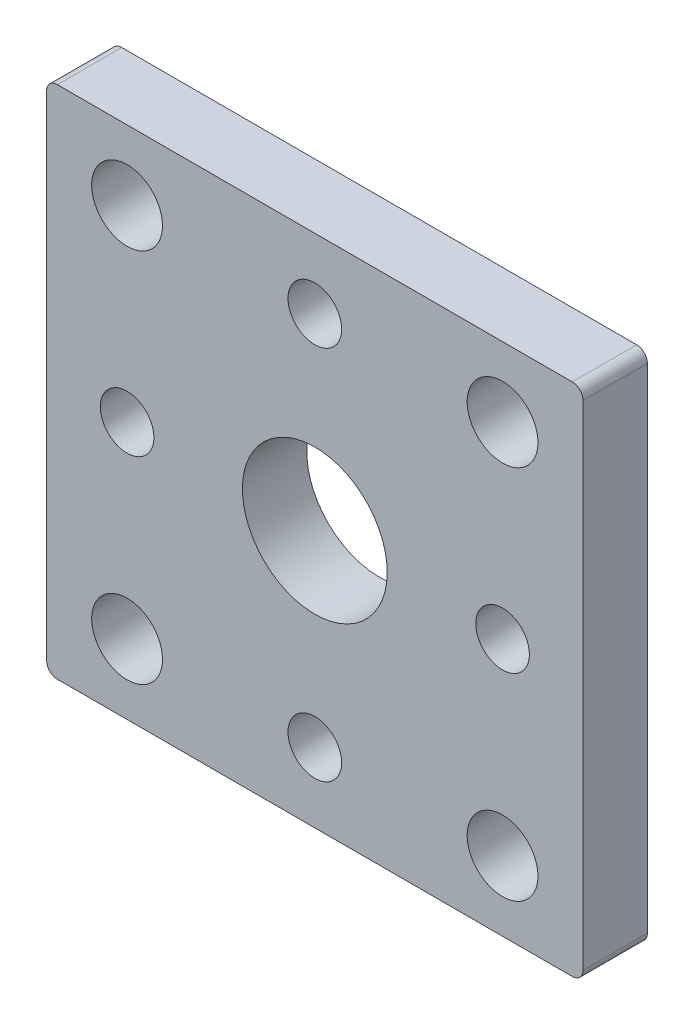
ISO-10303-21;
HEADER;
FILE_DESCRIPTION(('STEP AP214'),'2;1');
FILE_NAME('part.step','',(''),(''),'','','');
FILE_SCHEMA(('AUTOMOTIVE_DESIGN { 1 0 10303 214 1 1 1 1 }'));
ENDSEC;
DATA;
#1=APPLICATION_CONTEXT('core data for automotive mechanical design processes');
#2=APPLICATION_PROTOCOL_DEFINITION('international standard','automotive_design',2000,#1);
#3=PRODUCT_CONTEXT('',#1,'mechanical');
#4=PRODUCT('Part','Part','',(#3));
#5=PRODUCT_RELATED_PRODUCT_CATEGORY('part','',(#4));
#6=PRODUCT_DEFINITION_FORMATION('','',#4);
#7=PRODUCT_DEFINITION_CONTEXT('part definition',#1,'design');
#8=PRODUCT_DEFINITION('design','',#6,#7);
#9=PRODUCT_DEFINITION_SHAPE('','',#8);
#10=(LENGTH_UNIT() NAMED_UNIT(*) SI_UNIT(.MILLI.,.METRE.));
#11=(NAMED_UNIT(*) PLANE_ANGLE_UNIT() SI_UNIT($,.RADIAN.));
#12=(NAMED_UNIT(*) SI_UNIT($,.STERADIAN.) SOLID_ANGLE_UNIT());
#13=UNCERTAINTY_MEASURE_WITH_UNIT(LENGTH_MEASURE(1.E-05),#10,'distance_accuracy_value','');
#14=(GEOMETRIC_REPRESENTATION_CONTEXT(3) GLOBAL_UNCERTAINTY_ASSIGNED_CONTEXT((#13)) GLOBAL_UNIT_ASSIGNED_CONTEXT((#10,
#11,#12)) REPRESENTATION_CONTEXT('',''));
#15=CARTESIAN_POINT('',(0.,0.,0.));
#16=DIRECTION('',(0.,0.,1.));
#17=DIRECTION('',(1.,0.,0.));
#18=AXIS2_PLACEMENT_3D('',#15,#16,#17);
#19=CARTESIAN_POINT('',(0.,0.,6.));
#20=DIRECTION('',(0.,0.,-1.));
#21=DIRECTION('',(-1.,0.,0.));
#22=AXIS2_PLACEMENT_3D('',#19,#20,#21);
#23=PLANE('',#22);
#24=CARTESIAN_POINT('',(25.,-6.5,6.));
#25=DIRECTION('',(0.,0.,1.));
#26=DIRECTION('',(1.,0.,0.));
#27=AXIS2_PLACEMENT_3D('',#24,#25,#26);
#28=CIRCLE('',#27,2.5);
#29=CARTESIAN_POINT('',(27.5,-6.5,6.));
#30=VERTEX_POINT('',#29);
#31=EDGE_CURVE('E293',#30,#30,#28,.T.);
#32=ORIENTED_EDGE('',*,*,#31,.F.);
#33=EDGE_LOOP('',(#32));
#34=FACE_BOUND('',#33,.T.);
#35=CARTESIAN_POINT('',(42.5,-24.,6.));
#36=DIRECTION('',(0.,0.,1.));
#37=DIRECTION('',(1.,0.,0.));
#38=AXIS2_PLACEMENT_3D('',#35,#36,#37);
#39=CIRCLE('',#38,2.5);
#40=CARTESIAN_POINT('',(45.,-24.,6.));
#41=VERTEX_POINT('',#40);
#42=EDGE_CURVE('E285',#41,#41,#39,.T.);
#43=ORIENTED_EDGE('',*,*,#42,.F.);
#44=EDGE_LOOP('',(#43));
#45=FACE_BOUND('',#44,.T.);
#46=CARTESIAN_POINT('',(25.,-41.5,6.));
#47=DIRECTION('',(0.,0.,1.));
#48=DIRECTION('',(1.,0.,0.));
#49=AXIS2_PLACEMENT_3D('',#46,#47,#48);
#50=CIRCLE('',#49,2.5);
#51=CARTESIAN_POINT('',(27.5,-41.5,6.));
#52=VERTEX_POINT('',#51);
#53=EDGE_CURVE('E277',#52,#52,#50,.T.);
#54=ORIENTED_EDGE('',*,*,#53,.F.);
#55=EDGE_LOOP('',(#54));
#56=FACE_BOUND('',#55,.T.);
#57=CARTESIAN_POINT('',(7.5,-24.,6.));
#58=DIRECTION('',(0.,0.,1.));
#59=DIRECTION('',(1.,0.,0.));
#60=AXIS2_PLACEMENT_3D('',#57,#58,#59);
#61=CIRCLE('',#60,2.5);
#62=CARTESIAN_POINT('',(10.,-24.,6.));
#63=VERTEX_POINT('',#62);
#64=EDGE_CURVE('E269',#63,#63,#61,.T.);
#65=ORIENTED_EDGE('',*,*,#64,.F.);
#66=EDGE_LOOP('',(#65));
#67=FACE_BOUND('',#66,.T.);
#68=CARTESIAN_POINT('',(7.50000000000001,-41.5,6.));
#69=DIRECTION('',(0.,0.,1.));
#70=DIRECTION('',(1.,0.,0.));
#71=AXIS2_PLACEMENT_3D('',#68,#69,#70);
#72=CIRCLE('',#71,3.3);
#73=CARTESIAN_POINT('',(10.8,-41.5,6.));
#74=VERTEX_POINT('',#73);
#75=EDGE_CURVE('E243',#74,#74,#72,.T.);
#76=ORIENTED_EDGE('',*,*,#75,.F.);
#77=EDGE_LOOP('',(#76));
#78=FACE_BOUND('',#77,.T.);
#79=CARTESIAN_POINT('',(42.5,-41.5,6.));
#80=DIRECTION('',(0.,0.,1.));
#81=DIRECTION('',(1.,0.,0.));
#82=AXIS2_PLACEMENT_3D('',#79,#80,#81);
#83=CIRCLE('',#82,3.3);
#84=CARTESIAN_POINT('',(45.8,-41.5,6.));
#85=VERTEX_POINT('',#84);
#86=EDGE_CURVE('E251',#85,#85,#83,.F.);
#87=ORIENTED_EDGE('',*,*,#86,.T.);
#88=EDGE_LOOP('',(#87));
#89=FACE_BOUND('',#88,.T.);
#90=DIRECTION('',(1.,0.,0.));
#91=VECTOR('',#90,1.);
#92=CARTESIAN_POINT('',(50.,-48.,6.));
#93=LINE('',#92,#91);
#94=CARTESIAN_POINT('',(1.,-48.,6.));
#95=VERTEX_POINT('',#94);
#96=CARTESIAN_POINT('',(49.,-48.,6.));
#97=VERTEX_POINT('',#96);
#98=EDGE_CURVE('E206',#95,#97,#93,.T.);
#99=ORIENTED_EDGE('',*,*,#98,.T.);
#100=CARTESIAN_POINT('',(49.,-47.,6.));
#101=DIRECTION('',(0.,0.,-1.));
#102=DIRECTION('',(-1.,0.,0.));
#103=AXIS2_PLACEMENT_3D('',#100,#101,#102);
#104=CIRCLE('',#103,1.);
#105=CARTESIAN_POINT('',(50.,-47.,6.));
#106=VERTEX_POINT('',#105);
#107=EDGE_CURVE('E177',#97,#106,#104,.F.);
#108=ORIENTED_EDGE('',*,*,#107,.T.);
#109=DIRECTION('',(0.,1.,0.));
#110=VECTOR('',#109,1.);
#111=CARTESIAN_POINT('',(50.,0.,6.));
#112=LINE('',#111,#110);
#113=CARTESIAN_POINT('',(50.,-1.,6.));
#114=VERTEX_POINT('',#113);
#115=EDGE_CURVE('E132',#106,#114,#112,.T.);
#116=ORIENTED_EDGE('',*,*,#115,.T.);
#117=CARTESIAN_POINT('',(49.,-1.,6.));
#118=DIRECTION('',(0.,0.,-1.));
#119=DIRECTION('',(-1.,0.,0.));
#120=AXIS2_PLACEMENT_3D('',#117,#118,#119);
#121=CIRCLE('',#120,1.);
#122=CARTESIAN_POINT('',(49.,0.,6.));
#123=VERTEX_POINT('',#122);
#124=EDGE_CURVE('E67',#114,#123,#121,.F.);
#125=ORIENTED_EDGE('',*,*,#124,.T.);
#126=DIRECTION('',(-1.,0.,0.));
#127=VECTOR('',#126,1.);
#128=CARTESIAN_POINT('',(0.,0.,6.));
#129=LINE('',#128,#127);
#130=CARTESIAN_POINT('',(1.,0.,6.));
#131=VERTEX_POINT('',#130);
#132=EDGE_CURVE('E155',#123,#131,#129,.T.);
#133=ORIENTED_EDGE('',*,*,#132,.T.);
#134=CARTESIAN_POINT('',(1.,-1.,6.));
#135=DIRECTION('',(0.,0.,-1.));
#136=DIRECTION('',(-1.,0.,0.));
#137=AXIS2_PLACEMENT_3D('',#134,#135,#136);
#138=CIRCLE('',#137,1.);
#139=CARTESIAN_POINT('',(0.,-1.00000000000001,6.));
#140=VERTEX_POINT('',#139);
#141=EDGE_CURVE('E171',#131,#140,#138,.F.);
#142=ORIENTED_EDGE('',*,*,#141,.T.);
#143=DIRECTION('',(0.,-1.,0.));
#144=VECTOR('',#143,1.);
#145=CARTESIAN_POINT('',(0.,-48.,6.));
#146=LINE('',#145,#144);
#147=CARTESIAN_POINT('',(0.,-47.,6.));
#148=VERTEX_POINT('',#147);
#149=EDGE_CURVE('E148',#140,#148,#146,.T.);
#150=ORIENTED_EDGE('',*,*,#149,.T.);
#151=CARTESIAN_POINT('',(1.,-47.,6.));
#152=DIRECTION('',(0.,0.,-1.));
#153=DIRECTION('',(-1.,0.,0.));
#154=AXIS2_PLACEMENT_3D('',#151,#152,#153);
#155=CIRCLE('',#154,1.);
#156=EDGE_CURVE('E174',#148,#95,#155,.F.);
#157=ORIENTED_EDGE('',*,*,#156,.T.);
#158=EDGE_LOOP('',(#99,#108,#116,#125,#133,#142,#150,#157));
#159=FACE_BOUND('',#158,.T.);
#160=CARTESIAN_POINT('',(7.50000000000001,-6.5,6.));
#161=DIRECTION('',(0.,0.,1.));
#162=DIRECTION('',(1.,0.,0.));
#163=AXIS2_PLACEMENT_3D('',#160,#161,#162);
#164=CIRCLE('',#163,3.3);
#165=CARTESIAN_POINT('',(10.8,-6.5,6.));
#166=VERTEX_POINT('',#165);
#167=EDGE_CURVE('E214',#166,#166,#164,.F.);
#168=ORIENTED_EDGE('',*,*,#167,.T.);
#169=EDGE_LOOP('',(#168));
#170=FACE_BOUND('',#169,.T.);
#171=CARTESIAN_POINT('',(42.5,-6.5,6.));
#172=DIRECTION('',(0.,0.,1.));
#173=DIRECTION('',(1.,0.,0.));
#174=AXIS2_PLACEMENT_3D('',#171,#172,#173);
#175=CIRCLE('',#174,3.3);
#176=CARTESIAN_POINT('',(45.8,-6.5,6.));
#177=VERTEX_POINT('',#176);
#178=EDGE_CURVE('E259',#177,#177,#175,.T.);
#179=ORIENTED_EDGE('',*,*,#178,.F.);
#180=EDGE_LOOP('',(#179));
#181=FACE_BOUND('',#180,.T.);
#182=CARTESIAN_POINT('',(25.,-24.,6.));
#183=DIRECTION('',(0.,0.,1.));
#184=DIRECTION('',(1.,0.,0.));
#185=AXIS2_PLACEMENT_3D('',#182,#183,#184);
#186=CIRCLE('',#185,6.75);
#187=CARTESIAN_POINT('',(31.75,-24.,6.));
#188=VERTEX_POINT('',#187);
#189=EDGE_CURVE('E234',#188,#188,#186,.T.);
#190=ORIENTED_EDGE('',*,*,#189,.F.);
#191=EDGE_LOOP('',(#190));
#192=FACE_BOUND('',#191,.T.);
#193=ADVANCED_FACE('F46',(#34,#45,#56,#67,#78,#89,#159,#170,#181,#192),#23,.F.);
#194=CARTESIAN_POINT('',(0.,0.,0.));
#195=DIRECTION('',(0.,0.,-1.));
#196=DIRECTION('',(-1.,0.,0.));
#197=AXIS2_PLACEMENT_3D('',#194,#195,#196);
#198=PLANE('',#197);
#199=CARTESIAN_POINT('',(25.,-6.5,0.));
#200=DIRECTION('',(0.,0.,1.));
#201=DIRECTION('',(1.,0.,0.));
#202=AXIS2_PLACEMENT_3D('',#199,#200,#201);
#203=CIRCLE('',#202,2.5);
#204=CARTESIAN_POINT('',(27.5,-6.5,0.));
#205=VERTEX_POINT('',#204);
#206=EDGE_CURVE('E289',#205,#205,#203,.T.);
#207=ORIENTED_EDGE('',*,*,#206,.T.);
#208=EDGE_LOOP('',(#207));
#209=FACE_BOUND('',#208,.T.);
#210=CARTESIAN_POINT('',(42.5,-24.,0.));
#211=DIRECTION('',(0.,0.,1.));
#212=DIRECTION('',(1.,0.,0.));
#213=AXIS2_PLACEMENT_3D('',#210,#211,#212);
#214=CIRCLE('',#213,2.5);
#215=CARTESIAN_POINT('',(45.,-24.,0.));
#216=VERTEX_POINT('',#215);
#217=EDGE_CURVE('E281',#216,#216,#214,.T.);
#218=ORIENTED_EDGE('',*,*,#217,.T.);
#219=EDGE_LOOP('',(#218));
#220=FACE_BOUND('',#219,.T.);
#221=CARTESIAN_POINT('',(25.,-41.5,0.));
#222=DIRECTION('',(0.,0.,1.));
#223=DIRECTION('',(1.,0.,0.));
#224=AXIS2_PLACEMENT_3D('',#221,#222,#223);
#225=CIRCLE('',#224,2.5);
#226=CARTESIAN_POINT('',(27.5,-41.5,0.));
#227=VERTEX_POINT('',#226);
#228=EDGE_CURVE('E273',#227,#227,#225,.T.);
#229=ORIENTED_EDGE('',*,*,#228,.T.);
#230=EDGE_LOOP('',(#229));
#231=FACE_BOUND('',#230,.T.);
#232=CARTESIAN_POINT('',(7.5,-24.,0.));
#233=DIRECTION('',(0.,0.,1.));
#234=DIRECTION('',(1.,0.,0.));
#235=AXIS2_PLACEMENT_3D('',#232,#233,#234);
#236=CIRCLE('',#235,2.5);
#237=CARTESIAN_POINT('',(10.,-24.,0.));
#238=VERTEX_POINT('',#237);
#239=EDGE_CURVE('E239',#238,#238,#236,.T.);
#240=ORIENTED_EDGE('',*,*,#239,.T.);
#241=EDGE_LOOP('',(#240));
#242=FACE_BOUND('',#241,.T.);
#243=CARTESIAN_POINT('',(42.5,-41.5,0.));
#244=DIRECTION('',(0.,0.,1.));
#245=DIRECTION('',(1.,0.,0.));
#246=AXIS2_PLACEMENT_3D('',#243,#244,#245);
#247=CIRCLE('',#246,3.3);
#248=CARTESIAN_POINT('',(45.8,-41.5,0.));
#249=VERTEX_POINT('',#248);
#250=EDGE_CURVE('E255',#249,#249,#247,.F.);
#251=ORIENTED_EDGE('',*,*,#250,.F.);
#252=EDGE_LOOP('',(#251));
#253=FACE_BOUND('',#252,.T.);
#254=CARTESIAN_POINT('',(7.50000000000001,-6.5,0.));
#255=DIRECTION('',(0.,0.,1.));
#256=DIRECTION('',(1.,0.,0.));
#257=AXIS2_PLACEMENT_3D('',#254,#255,#256);
#258=CIRCLE('',#257,3.3);
#259=CARTESIAN_POINT('',(10.8,-6.5,0.));
#260=VERTEX_POINT('',#259);
#261=EDGE_CURVE('E221',#260,#260,#258,.F.);
#262=ORIENTED_EDGE('',*,*,#261,.F.);
#263=EDGE_LOOP('',(#262));
#264=FACE_BOUND('',#263,.T.);
#265=DIRECTION('',(0.,1.,0.));
#266=VECTOR('',#265,1.);
#267=CARTESIAN_POINT('',(50.,0.,0.));
#268=LINE('',#267,#266);
#269=CARTESIAN_POINT('',(50.,-47.,0.));
#270=VERTEX_POINT('',#269);
#271=CARTESIAN_POINT('',(50.,-1.,0.));
#272=VERTEX_POINT('',#271);
#273=EDGE_CURVE('E130',#270,#272,#268,.T.);
#274=ORIENTED_EDGE('',*,*,#273,.F.);
#275=CARTESIAN_POINT('',(49.,-47.,0.));
#276=DIRECTION('',(0.,0.,-1.));
#277=DIRECTION('',(-1.,0.,0.));
#278=AXIS2_PLACEMENT_3D('',#275,#276,#277);
#279=CIRCLE('',#278,1.);
#280=CARTESIAN_POINT('',(49.,-48.,0.));
#281=VERTEX_POINT('',#280);
#282=EDGE_CURVE('E112',#270,#281,#279,.T.);
#283=ORIENTED_EDGE('',*,*,#282,.T.);
#284=DIRECTION('',(1.,0.,0.));
#285=VECTOR('',#284,1.);
#286=CARTESIAN_POINT('',(50.,-48.,0.));
#287=LINE('',#286,#285);
#288=CARTESIAN_POINT('',(1.,-48.,0.));
#289=VERTEX_POINT('',#288);
#290=EDGE_CURVE('E142',#289,#281,#287,.T.);
#291=ORIENTED_EDGE('',*,*,#290,.F.);
#292=CARTESIAN_POINT('',(1.,-47.,0.));
#293=DIRECTION('',(0.,0.,-1.));
#294=DIRECTION('',(-1.,0.,0.));
#295=AXIS2_PLACEMENT_3D('',#292,#293,#294);
#296=CIRCLE('',#295,1.);
#297=CARTESIAN_POINT('',(0.,-47.,0.));
#298=VERTEX_POINT('',#297);
#299=EDGE_CURVE('E124',#289,#298,#296,.T.);
#300=ORIENTED_EDGE('',*,*,#299,.T.);
#301=DIRECTION('',(0.,-1.,0.));
#302=VECTOR('',#301,1.);
#303=CARTESIAN_POINT('',(0.,-48.,0.));
#304=LINE('',#303,#302);
#305=CARTESIAN_POINT('',(0.,-1.00000000000001,0.));
#306=VERTEX_POINT('',#305);
#307=EDGE_CURVE('E150',#306,#298,#304,.T.);
#308=ORIENTED_EDGE('',*,*,#307,.F.);
#309=CARTESIAN_POINT('',(1.,-1.,0.));
#310=DIRECTION('',(0.,0.,-1.));
#311=DIRECTION('',(-1.,0.,0.));
#312=AXIS2_PLACEMENT_3D('',#309,#310,#311);
#313=CIRCLE('',#312,1.);
#314=CARTESIAN_POINT('',(1.,0.,0.));
#315=VERTEX_POINT('',#314);
#316=EDGE_CURVE('E159',#306,#315,#313,.T.);
#317=ORIENTED_EDGE('',*,*,#316,.T.);
#318=DIRECTION('',(-1.,0.,0.));
#319=VECTOR('',#318,1.);
#320=CARTESIAN_POINT('',(0.,0.,0.));
#321=LINE('',#320,#319);
#322=CARTESIAN_POINT('',(49.,0.,0.));
#323=VERTEX_POINT('',#322);
#324=EDGE_CURVE('E141',#323,#315,#321,.T.);
#325=ORIENTED_EDGE('',*,*,#324,.F.);
#326=CARTESIAN_POINT('',(49.,-1.,0.));
#327=DIRECTION('',(0.,0.,-1.));
#328=DIRECTION('',(-1.,0.,0.));
#329=AXIS2_PLACEMENT_3D('',#326,#327,#328);
#330=CIRCLE('',#329,1.);
#331=EDGE_CURVE('E134',#323,#272,#330,.T.);
#332=ORIENTED_EDGE('',*,*,#331,.T.);
#333=EDGE_LOOP('',(#274,#283,#291,#300,#308,#317,#325,#332));
#334=FACE_BOUND('',#333,.T.);
#335=CARTESIAN_POINT('',(42.5,-6.5,0.));
#336=DIRECTION('',(0.,0.,1.));
#337=DIRECTION('',(1.,0.,0.));
#338=AXIS2_PLACEMENT_3D('',#335,#336,#337);
#339=CIRCLE('',#338,3.3);
#340=CARTESIAN_POINT('',(45.8,-6.5,0.));
#341=VERTEX_POINT('',#340);
#342=EDGE_CURVE('E232',#341,#341,#339,.T.);
#343=ORIENTED_EDGE('',*,*,#342,.T.);
#344=EDGE_LOOP('',(#343));
#345=FACE_BOUND('',#344,.T.);
#346=CARTESIAN_POINT('',(7.50000000000001,-41.5,0.));
#347=DIRECTION('',(0.,0.,1.));
#348=DIRECTION('',(1.,0.,0.));
#349=AXIS2_PLACEMENT_3D('',#346,#347,#348);
#350=CIRCLE('',#349,3.3);
#351=CARTESIAN_POINT('',(10.8,-41.5,0.));
#352=VERTEX_POINT('',#351);
#353=EDGE_CURVE('E247',#352,#352,#350,.T.);
#354=ORIENTED_EDGE('',*,*,#353,.T.);
#355=EDGE_LOOP('',(#354));
#356=FACE_BOUND('',#355,.T.);
#357=CARTESIAN_POINT('',(25.,-24.,0.));
#358=DIRECTION('',(0.,0.,1.));
#359=DIRECTION('',(1.,0.,0.));
#360=AXIS2_PLACEMENT_3D('',#357,#358,#359);
#361=CIRCLE('',#360,6.75);
#362=CARTESIAN_POINT('',(31.75,-24.,0.));
#363=VERTEX_POINT('',#362);
#364=EDGE_CURVE('E238',#363,#363,#361,.T.);
#365=ORIENTED_EDGE('',*,*,#364,.T.);
#366=EDGE_LOOP('',(#365));
#367=FACE_BOUND('',#366,.T.);
#368=ADVANCED_FACE('F137',(#209,#220,#231,#242,#253,#264,#334,#345,#356,#367),#198,.T.);
#369=CARTESIAN_POINT('',(0.,-48.,6.));
#370=DIRECTION('',(1.,0.,0.));
#371=DIRECTION('',(0.,1.,0.));
#372=AXIS2_PLACEMENT_3D('',#369,#370,#371);
#373=PLANE('',#372);
#374=ORIENTED_EDGE('',*,*,#307,.T.);
#375=DIRECTION('',(0.,0.,-1.));
#376=VECTOR('',#375,1.);
#377=CARTESIAN_POINT('',(0.,-47.,6.));
#378=LINE('',#377,#376);
#379=EDGE_CURVE('E184',#298,#148,#378,.F.);
#380=ORIENTED_EDGE('',*,*,#379,.T.);
#381=ORIENTED_EDGE('',*,*,#149,.F.);
#382=DIRECTION('',(0.,0.,-1.));
#383=VECTOR('',#382,1.);
#384=CARTESIAN_POINT('',(0.,-1.,6.));
#385=LINE('',#384,#383);
#386=EDGE_CURVE('E180',#140,#306,#385,.T.);
#387=ORIENTED_EDGE('',*,*,#386,.T.);
#388=EDGE_LOOP('',(#374,#380,#381,#387));
#389=FACE_BOUND('',#388,.T.);
#390=ADVANCED_FACE('F201',(#389),#373,.F.);
#391=CARTESIAN_POINT('',(50.,-48.,6.));
#392=DIRECTION('',(0.,1.,0.));
#393=DIRECTION('',(-1.,0.,0.));
#394=AXIS2_PLACEMENT_3D('',#391,#392,#393);
#395=PLANE('',#394);
#396=ORIENTED_EDGE('',*,*,#290,.T.);
#397=DIRECTION('',(0.,0.,-1.));
#398=VECTOR('',#397,1.);
#399=CARTESIAN_POINT('',(49.,-48.,6.));
#400=LINE('',#399,#398);
#401=EDGE_CURVE('E117',#281,#97,#400,.F.);
#402=ORIENTED_EDGE('',*,*,#401,.T.);
#403=ORIENTED_EDGE('',*,*,#98,.F.);
#404=DIRECTION('',(0.,0.,-1.));
#405=VECTOR('',#404,1.);
#406=CARTESIAN_POINT('',(1.,-48.,6.));
#407=LINE('',#406,#405);
#408=EDGE_CURVE('E123',#95,#289,#407,.T.);
#409=ORIENTED_EDGE('',*,*,#408,.T.);
#410=EDGE_LOOP('',(#396,#402,#403,#409));
#411=FACE_BOUND('',#410,.T.);
#412=ADVANCED_FACE('F352',(#411),#395,.F.);
#413=CARTESIAN_POINT('',(50.,0.,6.));
#414=DIRECTION('',(-1.,0.,0.));
#415=DIRECTION('',(0.,-1.,0.));
#416=AXIS2_PLACEMENT_3D('',#413,#414,#415);
#417=PLANE('',#416);
#418=ORIENTED_EDGE('',*,*,#115,.F.);
#419=DIRECTION('',(0.,0.,-1.));
#420=VECTOR('',#419,1.);
#421=CARTESIAN_POINT('',(50.,-47.,6.));
#422=LINE('',#421,#420);
#423=EDGE_CURVE('E116',#106,#270,#422,.T.);
#424=ORIENTED_EDGE('',*,*,#423,.T.);
#425=ORIENTED_EDGE('',*,*,#273,.T.);
#426=DIRECTION('',(0.,0.,-1.));
#427=VECTOR('',#426,1.);
#428=CARTESIAN_POINT('',(50.,-1.,6.));
#429=LINE('',#428,#427);
#430=EDGE_CURVE('E135',#272,#114,#429,.F.);
#431=ORIENTED_EDGE('',*,*,#430,.T.);
#432=EDGE_LOOP('',(#418,#424,#425,#431));
#433=FACE_BOUND('',#432,.T.);
#434=ADVANCED_FACE('F129',(#433),#417,.F.);
#435=CARTESIAN_POINT('',(0.,0.,6.));
#436=DIRECTION('',(0.,-1.,0.));
#437=DIRECTION('',(0.,0.,-1.));
#438=AXIS2_PLACEMENT_3D('',#435,#436,#437);
#439=PLANE('',#438);
#440=ORIENTED_EDGE('',*,*,#324,.T.);
#441=DIRECTION('',(0.,0.,-1.));
#442=VECTOR('',#441,1.);
#443=CARTESIAN_POINT('',(1.,0.,6.));
#444=LINE('',#443,#442);
#445=EDGE_CURVE('E11',#315,#131,#444,.F.);
#446=ORIENTED_EDGE('',*,*,#445,.T.);
#447=ORIENTED_EDGE('',*,*,#132,.F.);
#448=DIRECTION('',(0.,0.,-1.));
#449=VECTOR('',#448,1.);
#450=CARTESIAN_POINT('',(49.,0.,6.));
#451=LINE('',#450,#449);
#452=EDGE_CURVE('E55',#123,#323,#451,.T.);
#453=ORIENTED_EDGE('',*,*,#452,.T.);
#454=EDGE_LOOP('',(#440,#446,#447,#453));
#455=FACE_BOUND('',#454,.T.);
#456=ADVANCED_FACE('F191',(#455),#439,.F.);
#457=CARTESIAN_POINT('',(49.,-47.,6.));
#458=DIRECTION('',(0.,0.,-1.));
#459=DIRECTION('',(-1.,0.,0.));
#460=AXIS2_PLACEMENT_3D('',#457,#458,#459);
#461=CYLINDRICAL_SURFACE('',#460,1.);
#462=ORIENTED_EDGE('',*,*,#107,.F.);
#463=ORIENTED_EDGE('',*,*,#401,.F.);
#464=ORIENTED_EDGE('',*,*,#282,.F.);
#465=ORIENTED_EDGE('',*,*,#423,.F.);
#466=EDGE_LOOP('',(#462,#463,#464,#465));
#467=FACE_BOUND('',#466,.T.);
#468=ADVANCED_FACE('F115',(#467),#461,.T.);
#469=CARTESIAN_POINT('',(1.,-47.,6.));
#470=DIRECTION('',(0.,0.,-1.));
#471=DIRECTION('',(-1.,0.,0.));
#472=AXIS2_PLACEMENT_3D('',#469,#470,#471);
#473=CYLINDRICAL_SURFACE('',#472,1.);
#474=ORIENTED_EDGE('',*,*,#156,.F.);
#475=ORIENTED_EDGE('',*,*,#379,.F.);
#476=ORIENTED_EDGE('',*,*,#299,.F.);
#477=ORIENTED_EDGE('',*,*,#408,.F.);
#478=EDGE_LOOP('',(#474,#475,#476,#477));
#479=FACE_BOUND('',#478,.T.);
#480=ADVANCED_FACE('F360',(#479),#473,.T.);
#481=CARTESIAN_POINT('',(1.,-1.,6.));
#482=DIRECTION('',(0.,0.,-1.));
#483=DIRECTION('',(-1.,0.,0.));
#484=AXIS2_PLACEMENT_3D('',#481,#482,#483);
#485=CYLINDRICAL_SURFACE('',#484,1.);
#486=ORIENTED_EDGE('',*,*,#141,.F.);
#487=ORIENTED_EDGE('',*,*,#445,.F.);
#488=ORIENTED_EDGE('',*,*,#316,.F.);
#489=ORIENTED_EDGE('',*,*,#386,.F.);
#490=EDGE_LOOP('',(#486,#487,#488,#489));
#491=FACE_BOUND('',#490,.T.);
#492=ADVANCED_FACE('F198',(#491),#485,.T.);
#493=CARTESIAN_POINT('',(49.,-1.,6.));
#494=DIRECTION('',(0.,0.,-1.));
#495=DIRECTION('',(-1.,0.,0.));
#496=AXIS2_PLACEMENT_3D('',#493,#494,#495);
#497=CYLINDRICAL_SURFACE('',#496,1.);
#498=ORIENTED_EDGE('',*,*,#124,.F.);
#499=ORIENTED_EDGE('',*,*,#430,.F.);
#500=ORIENTED_EDGE('',*,*,#331,.F.);
#501=ORIENTED_EDGE('',*,*,#452,.F.);
#502=EDGE_LOOP('',(#498,#499,#500,#501));
#503=FACE_BOUND('',#502,.T.);
#504=ADVANCED_FACE('F48',(#503),#497,.T.);
#505=CARTESIAN_POINT('',(7.50000000000001,-6.5,0.));
#506=DIRECTION('',(0.,0.,1.));
#507=DIRECTION('',(1.,0.,0.));
#508=AXIS2_PLACEMENT_3D('',#505,#506,#507);
#509=CYLINDRICAL_SURFACE('',#508,3.3);
#510=ORIENTED_EDGE('',*,*,#261,.T.);
#511=EDGE_LOOP('',(#510));
#512=FACE_BOUND('',#511,.T.);
#513=ORIENTED_EDGE('',*,*,#167,.F.);
#514=EDGE_LOOP('',(#513));
#515=FACE_BOUND('',#514,.T.);
#516=ADVANCED_FACE('F341',(#512,#515),#509,.F.);
#517=CARTESIAN_POINT('',(42.5,-6.5,0.));
#518=DIRECTION('',(0.,0.,1.));
#519=DIRECTION('',(1.,0.,0.));
#520=AXIS2_PLACEMENT_3D('',#517,#518,#519);
#521=CYLINDRICAL_SURFACE('',#520,3.3);
#522=ORIENTED_EDGE('',*,*,#342,.F.);
#523=EDGE_LOOP('',(#522));
#524=FACE_BOUND('',#523,.T.);
#525=ORIENTED_EDGE('',*,*,#178,.T.);
#526=EDGE_LOOP('',(#525));
#527=FACE_BOUND('',#526,.T.);
#528=ADVANCED_FACE('F343',(#524,#527),#521,.F.);
#529=CARTESIAN_POINT('',(42.5,-41.5,0.));
#530=DIRECTION('',(0.,0.,1.));
#531=DIRECTION('',(1.,0.,0.));
#532=AXIS2_PLACEMENT_3D('',#529,#530,#531);
#533=CYLINDRICAL_SURFACE('',#532,3.3);
#534=ORIENTED_EDGE('',*,*,#250,.T.);
#535=EDGE_LOOP('',(#534));
#536=FACE_BOUND('',#535,.T.);
#537=ORIENTED_EDGE('',*,*,#86,.F.);
#538=EDGE_LOOP('',(#537));
#539=FACE_BOUND('',#538,.T.);
#540=ADVANCED_FACE('F335',(#536,#539),#533,.F.);
#541=CARTESIAN_POINT('',(7.50000000000001,-41.5,0.));
#542=DIRECTION('',(0.,0.,1.));
#543=DIRECTION('',(1.,0.,0.));
#544=AXIS2_PLACEMENT_3D('',#541,#542,#543);
#545=CYLINDRICAL_SURFACE('',#544,3.3);
#546=ORIENTED_EDGE('',*,*,#353,.F.);
#547=EDGE_LOOP('',(#546));
#548=FACE_BOUND('',#547,.T.);
#549=ORIENTED_EDGE('',*,*,#75,.T.);
#550=EDGE_LOOP('',(#549));
#551=FACE_BOUND('',#550,.T.);
#552=ADVANCED_FACE('F325',(#548,#551),#545,.F.);
#553=CARTESIAN_POINT('',(25.,-24.,0.));
#554=DIRECTION('',(0.,0.,1.));
#555=DIRECTION('',(1.,0.,0.));
#556=AXIS2_PLACEMENT_3D('',#553,#554,#555);
#557=CYLINDRICAL_SURFACE('',#556,6.75);
#558=ORIENTED_EDGE('',*,*,#364,.F.);
#559=EDGE_LOOP('',(#558));
#560=FACE_BOUND('',#559,.T.);
#561=ORIENTED_EDGE('',*,*,#189,.T.);
#562=EDGE_LOOP('',(#561));
#563=FACE_BOUND('',#562,.T.);
#564=ADVANCED_FACE('F322',(#560,#563),#557,.F.);
#565=CARTESIAN_POINT('',(7.5,-24.,6.));
#566=DIRECTION('',(0.,0.,1.));
#567=DIRECTION('',(1.,0.,0.));
#568=AXIS2_PLACEMENT_3D('',#565,#566,#567);
#569=CYLINDRICAL_SURFACE('',#568,2.5);
#570=ORIENTED_EDGE('',*,*,#239,.F.);
#571=EDGE_LOOP('',(#570));
#572=FACE_BOUND('',#571,.T.);
#573=ORIENTED_EDGE('',*,*,#64,.T.);
#574=EDGE_LOOP('',(#573));
#575=FACE_BOUND('',#574,.T.);
#576=ADVANCED_FACE('F324',(#572,#575),#569,.F.);
#577=CARTESIAN_POINT('',(25.,-41.5,6.));
#578=DIRECTION('',(0.,0.,1.));
#579=DIRECTION('',(1.,0.,0.));
#580=AXIS2_PLACEMENT_3D('',#577,#578,#579);
#581=CYLINDRICAL_SURFACE('',#580,2.5);
#582=ORIENTED_EDGE('',*,*,#228,.F.);
#583=EDGE_LOOP('',(#582));
#584=FACE_BOUND('',#583,.T.);
#585=ORIENTED_EDGE('',*,*,#53,.T.);
#586=EDGE_LOOP('',(#585));
#587=FACE_BOUND('',#586,.T.);
#588=ADVANCED_FACE('F332',(#584,#587),#581,.F.);
#589=CARTESIAN_POINT('',(42.5,-24.,6.));
#590=DIRECTION('',(0.,0.,1.));
#591=DIRECTION('',(1.,0.,0.));
#592=AXIS2_PLACEMENT_3D('',#589,#590,#591);
#593=CYLINDRICAL_SURFACE('',#592,2.5);
#594=ORIENTED_EDGE('',*,*,#217,.F.);
#595=EDGE_LOOP('',(#594));
#596=FACE_BOUND('',#595,.T.);
#597=ORIENTED_EDGE('',*,*,#42,.T.);
#598=EDGE_LOOP('',(#597));
#599=FACE_BOUND('',#598,.T.);
#600=ADVANCED_FACE('F406',(#596,#599),#593,.F.);
#601=CARTESIAN_POINT('',(25.,-6.5,6.));
#602=DIRECTION('',(0.,0.,1.));
#603=DIRECTION('',(1.,0.,0.));
#604=AXIS2_PLACEMENT_3D('',#601,#602,#603);
#605=CYLINDRICAL_SURFACE('',#604,2.5);
#606=ORIENTED_EDGE('',*,*,#206,.F.);
#607=EDGE_LOOP('',(#606));
#608=FACE_BOUND('',#607,.T.);
#609=ORIENTED_EDGE('',*,*,#31,.T.);
#610=EDGE_LOOP('',(#609));
#611=FACE_BOUND('',#610,.T.);
#612=ADVANCED_FACE('F300',(#608,#611),#605,.F.);
#613=CLOSED_SHELL('',(#193,#368,#390,#412,#434,#456,#468,#480,#492,#504,#516,#528,#540,#552,
#564,#576,#588,#600,#612));
#614=MANIFOLD_SOLID_BREP('B2',#613);
#615=ADVANCED_BREP_SHAPE_REPRESENTATION('',(#18,#614),#14);
#616=SHAPE_DEFINITION_REPRESENTATION(#9,#615);
ENDSEC;
END-ISO-10303-21;
